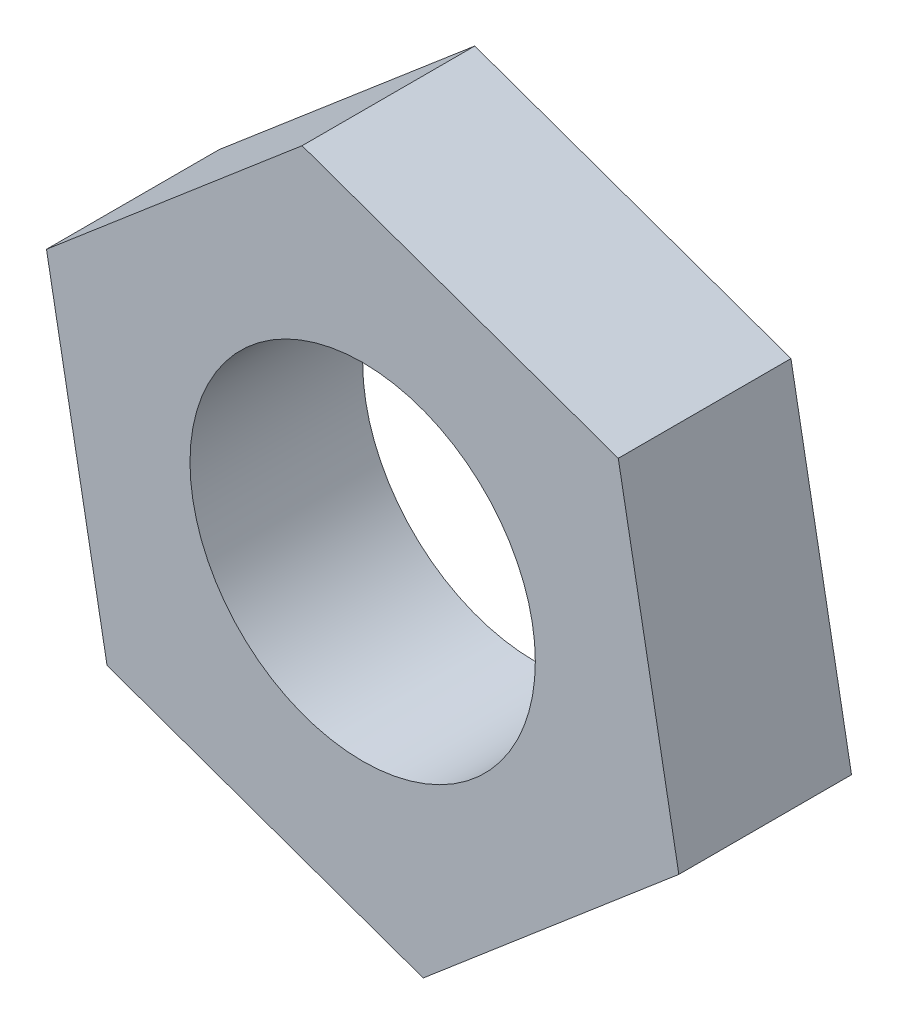
ISO-10303-21;
HEADER;
FILE_DESCRIPTION(('STEP AP214'),'2;1');
FILE_NAME('part.step','',(''),(''),'','','');
FILE_SCHEMA(('AUTOMOTIVE_DESIGN { 1 0 10303 214 1 1 1 1 }'));
ENDSEC;
DATA;
#1=APPLICATION_CONTEXT('core data for automotive mechanical design processes');
#2=APPLICATION_PROTOCOL_DEFINITION('international standard','automotive_design',2000,#1);
#3=PRODUCT_CONTEXT('',#1,'mechanical');
#4=PRODUCT('Part','Part','',(#3));
#5=PRODUCT_RELATED_PRODUCT_CATEGORY('part','',(#4));
#6=PRODUCT_DEFINITION_FORMATION('','',#4);
#7=PRODUCT_DEFINITION_CONTEXT('part definition',#1,'design');
#8=PRODUCT_DEFINITION('design','',#6,#7);
#9=PRODUCT_DEFINITION_SHAPE('','',#8);
#10=(LENGTH_UNIT() NAMED_UNIT(*) SI_UNIT(.MILLI.,.METRE.));
#11=(NAMED_UNIT(*) PLANE_ANGLE_UNIT() SI_UNIT($,.RADIAN.));
#12=(NAMED_UNIT(*) SI_UNIT($,.STERADIAN.) SOLID_ANGLE_UNIT());
#13=UNCERTAINTY_MEASURE_WITH_UNIT(LENGTH_MEASURE(1.E-05),#10,'distance_accuracy_value','');
#14=(GEOMETRIC_REPRESENTATION_CONTEXT(3) GLOBAL_UNCERTAINTY_ASSIGNED_CONTEXT((#13)) GLOBAL_UNIT_ASSIGNED_CONTEXT((#10,
#11,#12)) REPRESENTATION_CONTEXT('',''));
#15=CARTESIAN_POINT('',(0.,0.,0.));
#16=DIRECTION('',(0.,0.,1.));
#17=DIRECTION('',(1.,0.,0.));
#18=AXIS2_PLACEMENT_3D('',#15,#16,#17);
#19=CARTESIAN_POINT('',(985.210087970001,180.720883856323,3.));
#20=DIRECTION('',(-0.983589015732312,-0.18042352432746,0.));
#21=DIRECTION('',(0.18042352432746,-0.983589015732312,0.));
#22=AXIS2_PLACEMENT_3D('',#19,#20,#21);
#23=PLANE('',#22);
#24=DIRECTION('',(-0.18042352432746,0.983589015732312,0.));
#25=VECTOR('',#24,1.);
#26=CARTESIAN_POINT('',(985.210087970001,180.720883856323,0.));
#27=LINE('',#26,#25);
#28=CARTESIAN_POINT('',(1328.94014214927,-1693.14288711284,0.));
#29=VERTEX_POINT('',#28);
#30=CARTESIAN_POINT('',(1327.88805220212,-1687.40735944571,0.));
#31=VERTEX_POINT('',#30);
#32=EDGE_CURVE('E123',#29,#31,#27,.T.);
#33=ORIENTED_EDGE('',*,*,#32,.T.);
#34=DIRECTION('',(0.,0.,-1.));
#35=VECTOR('',#34,1.);
#36=CARTESIAN_POINT('',(1327.88805220212,-1687.40735944571,3.));
#37=LINE('',#36,#35);
#38=CARTESIAN_POINT('',(1327.88805220212,-1687.40735944571,3.));
#39=VERTEX_POINT('',#38);
#40=EDGE_CURVE('E11',#39,#31,#37,.T.);
#41=ORIENTED_EDGE('',*,*,#40,.F.);
#42=DIRECTION('',(-0.18042352432746,0.983589015732312,0.));
#43=VECTOR('',#42,1.);
#44=CARTESIAN_POINT('',(985.210087970001,180.720883856323,3.));
#45=LINE('',#44,#43);
#46=CARTESIAN_POINT('',(1328.94014214927,-1693.14288711284,3.));
#47=VERTEX_POINT('',#46);
#48=EDGE_CURVE('E136',#47,#39,#45,.T.);
#49=ORIENTED_EDGE('',*,*,#48,.F.);
#50=DIRECTION('',(0.,0.,-1.));
#51=VECTOR('',#50,1.);
#52=CARTESIAN_POINT('',(1328.94014214927,-1693.14288711284,3.));
#53=LINE('',#52,#51);
#54=EDGE_CURVE('E122',#47,#29,#53,.T.);
#55=ORIENTED_EDGE('',*,*,#54,.T.);
#56=EDGE_LOOP('',(#33,#41,#49,#55));
#57=FACE_BOUND('',#56,.T.);
#58=ADVANCED_FACE('F35',(#57),#23,.F.);
#59=CARTESIAN_POINT('',(-383.866701153782,-1077.69139056009,3.));
#60=DIRECTION('',(-0.335543152358286,-0.942024836671233,0.));
#61=DIRECTION('',(0.942024836671233,-0.335543152358286,0.));
#62=AXIS2_PLACEMENT_3D('',#59,#60,#61);
#63=PLANE('',#62);
#64=DIRECTION('',(-0.942024836671233,0.335543152358286,0.));
#65=VECTOR('',#64,1.);
#66=CARTESIAN_POINT('',(-383.866701153782,-1077.69139056009,0.));
#67=LINE('',#66,#65);
#68=CARTESIAN_POINT('',(1322.3948945647,-1685.45073223344,0.));
#69=VERTEX_POINT('',#68);
#70=EDGE_CURVE('E126',#31,#69,#67,.T.);
#71=ORIENTED_EDGE('',*,*,#70,.T.);
#72=DIRECTION('',(0.,0.,-1.));
#73=VECTOR('',#72,1.);
#74=CARTESIAN_POINT('',(1322.3948945647,-1685.45073223344,3.));
#75=LINE('',#74,#73);
#76=CARTESIAN_POINT('',(1322.3948945647,-1685.45073223344,3.));
#77=VERTEX_POINT('',#76);
#78=EDGE_CURVE('E43',#77,#69,#75,.T.);
#79=ORIENTED_EDGE('',*,*,#78,.F.);
#80=DIRECTION('',(-0.942024836671233,0.335543152358286,0.));
#81=VECTOR('',#80,1.);
#82=CARTESIAN_POINT('',(-383.866701153782,-1077.69139056009,3.));
#83=LINE('',#82,#81);
#84=EDGE_CURVE('E88',#39,#77,#83,.T.);
#85=ORIENTED_EDGE('',*,*,#84,.F.);
#86=ORIENTED_EDGE('',*,*,#40,.T.);
#87=EDGE_LOOP('',(#71,#79,#85,#86));
#88=FACE_BOUND('',#87,.T.);
#89=ADVANCED_FACE('F162',(#88),#63,.F.);
#90=CARTESIAN_POINT('',(1387.21606769467,-1630.29445502501,3.));
#91=DIRECTION('',(0.648045863374064,-0.761601312343777,0.));
#92=DIRECTION('',(0.761601312343777,0.648045863374064,0.));
#93=AXIS2_PLACEMENT_3D('',#90,#91,#92);
#94=PLANE('',#93);
#95=DIRECTION('',(-0.761601312343777,-0.648045863374064,0.));
#96=VECTOR('',#95,1.);
#97=CARTESIAN_POINT('',(1387.21606769467,-1630.29445502501,0.));
#98=LINE('',#97,#96);
#99=CARTESIAN_POINT('',(1317.95382687443,-1689.22963268831,0.));
#100=VERTEX_POINT('',#99);
#101=EDGE_CURVE('E128',#69,#100,#98,.T.);
#102=ORIENTED_EDGE('',*,*,#101,.T.);
#103=DIRECTION('',(0.,0.,-1.));
#104=VECTOR('',#103,1.);
#105=CARTESIAN_POINT('',(1317.95382687443,-1689.22963268831,3.));
#106=LINE('',#105,#104);
#107=CARTESIAN_POINT('',(1317.95382687443,-1689.22963268831,3.));
#108=VERTEX_POINT('',#107);
#109=EDGE_CURVE('E111',#108,#100,#106,.T.);
#110=ORIENTED_EDGE('',*,*,#109,.F.);
#111=DIRECTION('',(-0.761601312343777,-0.648045863374064,0.));
#112=VECTOR('',#111,1.);
#113=CARTESIAN_POINT('',(1387.21606769467,-1630.29445502501,3.));
#114=LINE('',#113,#112);
#115=EDGE_CURVE('E102',#77,#108,#114,.T.);
#116=ORIENTED_EDGE('',*,*,#115,.F.);
#117=ORIENTED_EDGE('',*,*,#78,.T.);
#118=EDGE_LOOP('',(#102,#110,#116,#117));
#119=FACE_BOUND('',#118,.T.);
#120=ADVANCED_FACE('F142',(#119),#94,.F.);
#121=CARTESIAN_POINT('',(975.27586264234,178.898610613714,3.));
#122=DIRECTION('',(0.983589015732314,0.180423524327446,0.));
#123=DIRECTION('',(-0.180423524327446,0.983589015732315,0.));
#124=AXIS2_PLACEMENT_3D('',#121,#122,#123);
#125=PLANE('',#124);
#126=DIRECTION('',(0.180423524327446,-0.983589015732315,0.));
#127=VECTOR('',#126,1.);
#128=CARTESIAN_POINT('',(975.27586264234,178.898610613714,0.));
#129=LINE('',#128,#127);
#130=CARTESIAN_POINT('',(1319.00591682158,-1694.96516035544,0.));
#131=VERTEX_POINT('',#130);
#132=EDGE_CURVE('E110',#100,#131,#129,.T.);
#133=ORIENTED_EDGE('',*,*,#132,.T.);
#134=DIRECTION('',(0.,0.,-1.));
#135=VECTOR('',#134,1.);
#136=CARTESIAN_POINT('',(1319.00591682158,-1694.96516035544,3.));
#137=LINE('',#136,#135);
#138=CARTESIAN_POINT('',(1319.00591682158,-1694.96516035544,3.));
#139=VERTEX_POINT('',#138);
#140=EDGE_CURVE('E107',#139,#131,#137,.T.);
#141=ORIENTED_EDGE('',*,*,#140,.F.);
#142=DIRECTION('',(0.180423524327446,-0.983589015732315,0.));
#143=VECTOR('',#142,1.);
#144=CARTESIAN_POINT('',(975.27586264234,178.898610613714,3.));
#145=LINE('',#144,#143);
#146=EDGE_CURVE('E95',#108,#139,#145,.T.);
#147=ORIENTED_EDGE('',*,*,#146,.F.);
#148=ORIENTED_EDGE('',*,*,#109,.T.);
#149=EDGE_LOOP('',(#133,#141,#147,#148));
#150=FACE_BOUND('',#149,.T.);
#151=ADVANCED_FACE('F108',(#150),#125,.F.);
#152=CARTESIAN_POINT('',(-387.25567889687,-1087.20581868221,3.));
#153=DIRECTION('',(0.335543152358231,0.942024836671253,0.));
#154=DIRECTION('',(-0.942024836671253,0.335543152358231,0.));
#155=AXIS2_PLACEMENT_3D('',#152,#153,#154);
#156=PLANE('',#155);
#157=DIRECTION('',(0.942024836671253,-0.335543152358231,0.));
#158=VECTOR('',#157,1.);
#159=CARTESIAN_POINT('',(-387.25567889687,-1087.20581868221,0.));
#160=LINE('',#159,#158);
#161=CARTESIAN_POINT('',(1324.499074459,-1696.9217875677,0.));
#162=VERTEX_POINT('',#161);
#163=EDGE_CURVE('E74',#131,#162,#160,.T.);
#164=ORIENTED_EDGE('',*,*,#163,.T.);
#165=DIRECTION('',(0.,0.,-1.));
#166=VECTOR('',#165,1.);
#167=CARTESIAN_POINT('',(1324.499074459,-1696.9217875677,3.));
#168=LINE('',#167,#166);
#169=CARTESIAN_POINT('',(1324.499074459,-1696.9217875677,3.));
#170=VERTEX_POINT('',#169);
#171=EDGE_CURVE('E112',#170,#162,#168,.T.);
#172=ORIENTED_EDGE('',*,*,#171,.F.);
#173=DIRECTION('',(0.942024836671253,-0.335543152358231,0.));
#174=VECTOR('',#173,1.);
#175=CARTESIAN_POINT('',(-387.25567889687,-1087.20581868221,3.));
#176=LINE('',#175,#174);
#177=EDGE_CURVE('E100',#139,#170,#176,.T.);
#178=ORIENTED_EDGE('',*,*,#177,.F.);
#179=ORIENTED_EDGE('',*,*,#140,.T.);
#180=EDGE_LOOP('',(#164,#172,#178,#179));
#181=FACE_BOUND('',#180,.T.);
#182=ADVANCED_FACE('F114',(#181),#156,.F.);
#183=CARTESIAN_POINT('',(1393.76131527921,-1637.98660990445,3.));
#184=DIRECTION('',(-0.648045863374045,0.761601312343793,0.));
#185=DIRECTION('',(-0.761601312343793,-0.648045863374045,0.));
#186=AXIS2_PLACEMENT_3D('',#183,#184,#185);
#187=PLANE('',#186);
#188=DIRECTION('',(0.761601312343793,0.648045863374046,0.));
#189=VECTOR('',#188,1.);
#190=CARTESIAN_POINT('',(1393.76131527921,-1637.98660990445,0.));
#191=LINE('',#190,#189);
#192=EDGE_CURVE('E80',#162,#29,#191,.T.);
#193=ORIENTED_EDGE('',*,*,#192,.T.);
#194=ORIENTED_EDGE('',*,*,#54,.F.);
#195=DIRECTION('',(0.761601312343793,0.648045863374046,0.));
#196=VECTOR('',#195,1.);
#197=CARTESIAN_POINT('',(1393.76131527921,-1637.98660990445,3.));
#198=LINE('',#197,#196);
#199=EDGE_CURVE('E51',#170,#47,#198,.T.);
#200=ORIENTED_EDGE('',*,*,#199,.F.);
#201=ORIENTED_EDGE('',*,*,#171,.T.);
#202=EDGE_LOOP('',(#193,#194,#200,#201));
#203=FACE_BOUND('',#202,.T.);
#204=ADVANCED_FACE('F150',(#203),#187,.F.);
#205=CARTESIAN_POINT('',(1323.44698451185,-1691.18625990057,3.));
#206=DIRECTION('',(0.,0.,-1.));
#207=DIRECTION('',(-1.,0.,0.));
#208=AXIS2_PLACEMENT_3D('',#205,#206,#207);
#209=CYLINDRICAL_SURFACE('',#208,2.99999999999994);
#210=CARTESIAN_POINT('',(1323.44698451185,-1691.18625990057,3.));
#211=DIRECTION('',(0.,0.,1.));
#212=DIRECTION('',(1.,0.,0.));
#213=AXIS2_PLACEMENT_3D('',#210,#211,#212);
#214=CIRCLE('',#213,2.99999999999994);
#215=CARTESIAN_POINT('',(1326.44698451184,-1691.18625990057,3.));
#216=VERTEX_POINT('',#215);
#217=EDGE_CURVE('E116',#216,#216,#214,.T.);
#218=ORIENTED_EDGE('',*,*,#217,.T.);
#219=EDGE_LOOP('',(#218));
#220=FACE_BOUND('',#219,.T.);
#221=CARTESIAN_POINT('',(1323.44698451185,-1691.18625990057,0.));
#222=DIRECTION('',(0.,0.,1.));
#223=DIRECTION('',(1.,0.,0.));
#224=AXIS2_PLACEMENT_3D('',#221,#222,#223);
#225=CIRCLE('',#224,2.99999999999994);
#226=CARTESIAN_POINT('',(1326.44698451184,-1691.18625990057,0.));
#227=VERTEX_POINT('',#226);
#228=EDGE_CURVE('E133',#227,#227,#225,.T.);
#229=ORIENTED_EDGE('',*,*,#228,.F.);
#230=EDGE_LOOP('',(#229));
#231=FACE_BOUND('',#230,.T.);
#232=ADVANCED_FACE('F152',(#220,#231),#209,.F.);
#233=CARTESIAN_POINT('',(0.,0.,3.));
#234=DIRECTION('',(0.,0.,1.));
#235=DIRECTION('',(1.,0.,0.));
#236=AXIS2_PLACEMENT_3D('',#233,#234,#235);
#237=PLANE('',#236);
#238=ORIENTED_EDGE('',*,*,#48,.T.);
#239=ORIENTED_EDGE('',*,*,#84,.T.);
#240=ORIENTED_EDGE('',*,*,#115,.T.);
#241=ORIENTED_EDGE('',*,*,#146,.T.);
#242=ORIENTED_EDGE('',*,*,#177,.T.);
#243=ORIENTED_EDGE('',*,*,#199,.T.);
#244=EDGE_LOOP('',(#238,#239,#240,#241,#242,#243));
#245=FACE_BOUND('',#244,.T.);
#246=ORIENTED_EDGE('',*,*,#217,.F.);
#247=EDGE_LOOP('',(#246));
#248=FACE_BOUND('',#247,.T.);
#249=ADVANCED_FACE('F97',(#245,#248),#237,.T.);
#250=CARTESIAN_POINT('',(0.,0.,0.));
#251=DIRECTION('',(0.,0.,1.));
#252=DIRECTION('',(1.,0.,0.));
#253=AXIS2_PLACEMENT_3D('',#250,#251,#252);
#254=PLANE('',#253);
#255=ORIENTED_EDGE('',*,*,#32,.F.);
#256=ORIENTED_EDGE('',*,*,#192,.F.);
#257=ORIENTED_EDGE('',*,*,#163,.F.);
#258=ORIENTED_EDGE('',*,*,#132,.F.);
#259=ORIENTED_EDGE('',*,*,#101,.F.);
#260=ORIENTED_EDGE('',*,*,#70,.F.);
#261=EDGE_LOOP('',(#255,#256,#257,#258,#259,#260));
#262=FACE_BOUND('',#261,.T.);
#263=ORIENTED_EDGE('',*,*,#228,.T.);
#264=EDGE_LOOP('',(#263));
#265=FACE_BOUND('',#264,.T.);
#266=ADVANCED_FACE('F145',(#262,#265),#254,.F.);
#267=CLOSED_SHELL('',(#58,#89,#120,#151,#182,#204,#232,#249,#266));
#268=MANIFOLD_SOLID_BREP('B2',#267);
#269=ADVANCED_BREP_SHAPE_REPRESENTATION('',(#18,#268),#14);
#270=SHAPE_DEFINITION_REPRESENTATION(#9,#269);
ENDSEC;
END-ISO-10303-21;
